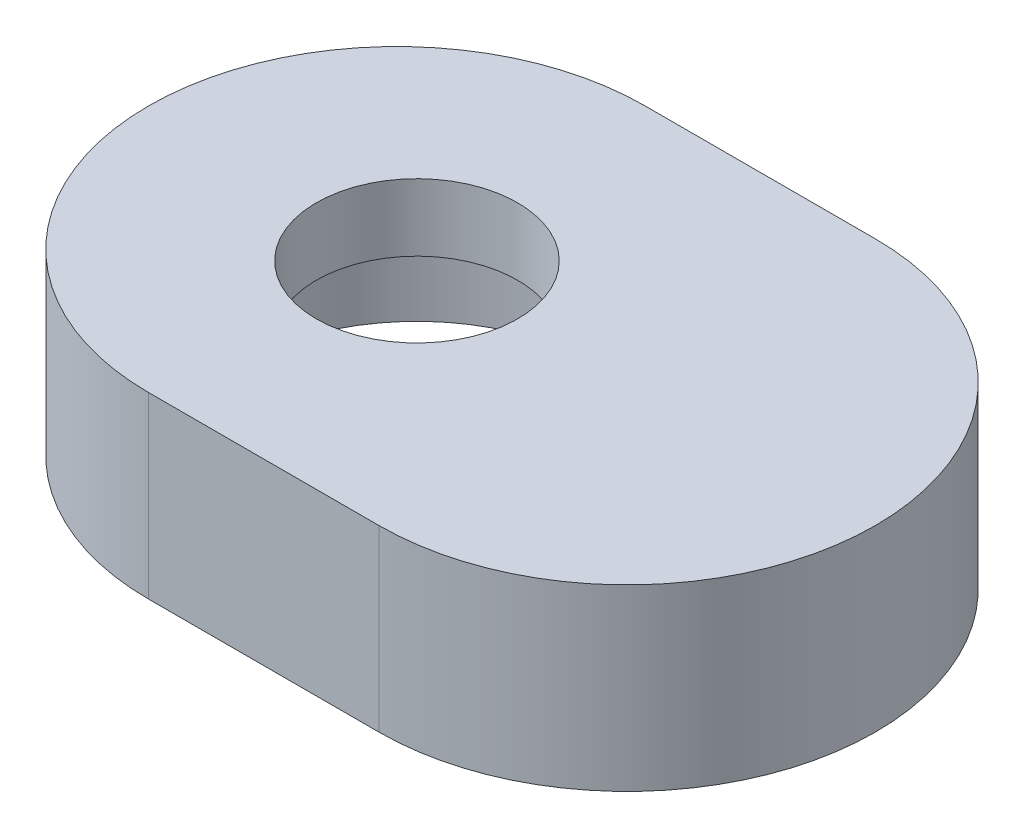
ISO-10303-21;
HEADER;
FILE_DESCRIPTION(('STEP AP214'),'2;1');
FILE_NAME('part.step','',(''),(''),'','','');
FILE_SCHEMA(('AUTOMOTIVE_DESIGN { 1 0 10303 214 1 1 1 1 }'));
ENDSEC;
DATA;
#1=APPLICATION_CONTEXT('core data for automotive mechanical design processes');
#2=APPLICATION_PROTOCOL_DEFINITION('international standard','automotive_design',2000,#1);
#3=PRODUCT_CONTEXT('',#1,'mechanical');
#4=PRODUCT('Part','Part','',(#3));
#5=PRODUCT_RELATED_PRODUCT_CATEGORY('part','',(#4));
#6=PRODUCT_DEFINITION_FORMATION('','',#4);
#7=PRODUCT_DEFINITION_CONTEXT('part definition',#1,'design');
#8=PRODUCT_DEFINITION('design','',#6,#7);
#9=PRODUCT_DEFINITION_SHAPE('','',#8);
#10=(LENGTH_UNIT() NAMED_UNIT(*) SI_UNIT(.MILLI.,.METRE.));
#11=(NAMED_UNIT(*) PLANE_ANGLE_UNIT() SI_UNIT($,.RADIAN.));
#12=(NAMED_UNIT(*) SI_UNIT($,.STERADIAN.) SOLID_ANGLE_UNIT());
#13=UNCERTAINTY_MEASURE_WITH_UNIT(LENGTH_MEASURE(1.E-05),#10,'distance_accuracy_value','');
#14=(GEOMETRIC_REPRESENTATION_CONTEXT(3) GLOBAL_UNCERTAINTY_ASSIGNED_CONTEXT((#13)) GLOBAL_UNIT_ASSIGNED_CONTEXT((#10,
#11,#12)) REPRESENTATION_CONTEXT('',''));
#15=CARTESIAN_POINT('',(0.,0.,0.));
#16=DIRECTION('',(0.,0.,1.));
#17=DIRECTION('',(1.,0.,0.));
#18=AXIS2_PLACEMENT_3D('',#15,#16,#17);
#19=CARTESIAN_POINT('',(-4.25,8.,0.));
#20=DIRECTION('',(0.,-1.,0.));
#21=DIRECTION('',(0.,0.,-1.));
#22=AXIS2_PLACEMENT_3D('',#19,#20,#21);
#23=CYLINDRICAL_SURFACE('',#22,8.);
#24=CARTESIAN_POINT('',(-4.25,0.,0.));
#25=DIRECTION('',(0.,1.,0.));
#26=DIRECTION('',(0.,0.,1.));
#27=AXIS2_PLACEMENT_3D('',#24,#25,#26);
#28=CIRCLE('',#27,8.);
#29=CARTESIAN_POINT('',(-4.25,0.,8.));
#30=VERTEX_POINT('',#29);
#31=EDGE_CURVE('E119',#30,#30,#28,.T.);
#32=ORIENTED_EDGE('',*,*,#31,.F.);
#33=EDGE_LOOP('',(#32));
#34=FACE_BOUND('',#33,.T.);
#35=CARTESIAN_POINT('',(-4.25,5.,0.));
#36=DIRECTION('',(0.,1.,0.));
#37=DIRECTION('',(0.,0.,1.));
#38=AXIS2_PLACEMENT_3D('',#35,#36,#37);
#39=CIRCLE('',#38,8.);
#40=CARTESIAN_POINT('',(-4.25,5.,8.));
#41=VERTEX_POINT('',#40);
#42=EDGE_CURVE('E47',#41,#41,#39,.T.);
#43=ORIENTED_EDGE('',*,*,#42,.T.);
#44=EDGE_LOOP('',(#43));
#45=FACE_BOUND('',#44,.T.);
#46=ADVANCED_FACE('F43',(#34,#45),#23,.F.);
#47=CARTESIAN_POINT('',(-5.15000000000002,8.,0.));
#48=DIRECTION('',(0.,1.,0.));
#49=DIRECTION('',(0.,0.,1.));
#50=AXIS2_PLACEMENT_3D('',#47,#48,#49);
#51=PLANE('',#50);
#52=CARTESIAN_POINT('',(-5.15000000000002,8.,0.));
#53=DIRECTION('',(0.,1.,0.));
#54=DIRECTION('',(0.,0.,1.));
#55=AXIS2_PLACEMENT_3D('',#52,#53,#54);
#56=CIRCLE('',#55,11.1);
#57=CARTESIAN_POINT('',(-5.15000000000002,8.,-11.1));
#58=VERTEX_POINT('',#57);
#59=CARTESIAN_POINT('',(-5.15000000000002,8.,11.1));
#60=VERTEX_POINT('',#59);
#61=EDGE_CURVE('E98',#58,#60,#56,.T.);
#62=ORIENTED_EDGE('',*,*,#61,.T.);
#63=DIRECTION('',(1.,0.,0.));
#64=VECTOR('',#63,1.);
#65=CARTESIAN_POINT('',(-5.15000000000002,8.,11.1));
#66=LINE('',#65,#64);
#67=CARTESIAN_POINT('',(5.15000000000002,8.,11.1));
#68=VERTEX_POINT('',#67);
#69=EDGE_CURVE('E92',#60,#68,#66,.T.);
#70=ORIENTED_EDGE('',*,*,#69,.T.);
#71=CARTESIAN_POINT('',(5.14999999999999,8.,0.));
#72=DIRECTION('',(0.,1.,0.));
#73=DIRECTION('',(0.,0.,1.));
#74=AXIS2_PLACEMENT_3D('',#71,#72,#73);
#75=CIRCLE('',#74,11.1);
#76=CARTESIAN_POINT('',(5.15000000000002,8.,-11.1));
#77=VERTEX_POINT('',#76);
#78=EDGE_CURVE('E96',#68,#77,#75,.T.);
#79=ORIENTED_EDGE('',*,*,#78,.T.);
#80=DIRECTION('',(-1.,0.,0.));
#81=VECTOR('',#80,1.);
#82=CARTESIAN_POINT('',(-5.15000000000002,8.,-11.1));
#83=LINE('',#82,#81);
#84=EDGE_CURVE('E62',#77,#58,#83,.T.);
#85=ORIENTED_EDGE('',*,*,#84,.T.);
#86=EDGE_LOOP('',(#62,#70,#79,#85));
#87=FACE_BOUND('',#86,.T.);
#88=CARTESIAN_POINT('',(-4.25,8.,0.));
#89=DIRECTION('',(0.,1.,0.));
#90=DIRECTION('',(0.,0.,1.));
#91=AXIS2_PLACEMENT_3D('',#88,#89,#90);
#92=CIRCLE('',#91,4.5);
#93=CARTESIAN_POINT('',(-4.25,8.,4.5));
#94=VERTEX_POINT('',#93);
#95=EDGE_CURVE('E140',#94,#94,#92,.T.);
#96=ORIENTED_EDGE('',*,*,#95,.F.);
#97=EDGE_LOOP('',(#96));
#98=FACE_BOUND('',#97,.T.);
#99=ADVANCED_FACE('F93',(#87,#98),#51,.T.);
#100=CARTESIAN_POINT('',(-5.15000000000002,0.,0.));
#101=DIRECTION('',(0.,1.,0.));
#102=DIRECTION('',(0.,0.,1.));
#103=AXIS2_PLACEMENT_3D('',#100,#101,#102);
#104=PLANE('',#103);
#105=CARTESIAN_POINT('',(-5.15000000000002,0.,0.));
#106=DIRECTION('',(0.,1.,0.));
#107=DIRECTION('',(0.,0.,1.));
#108=AXIS2_PLACEMENT_3D('',#105,#106,#107);
#109=CIRCLE('',#108,11.1);
#110=CARTESIAN_POINT('',(-5.15000000000002,0.,-11.1));
#111=VERTEX_POINT('',#110);
#112=CARTESIAN_POINT('',(-5.15000000000002,0.,11.1));
#113=VERTEX_POINT('',#112);
#114=EDGE_CURVE('E115',#111,#113,#109,.T.);
#115=ORIENTED_EDGE('',*,*,#114,.F.);
#116=DIRECTION('',(-1.,0.,0.));
#117=VECTOR('',#116,1.);
#118=CARTESIAN_POINT('',(-5.15000000000002,0.,-11.1));
#119=LINE('',#118,#117);
#120=CARTESIAN_POINT('',(5.15000000000002,0.,-11.1));
#121=VERTEX_POINT('',#120);
#122=EDGE_CURVE('E85',#121,#111,#119,.T.);
#123=ORIENTED_EDGE('',*,*,#122,.F.);
#124=CARTESIAN_POINT('',(5.14999999999999,0.,0.));
#125=DIRECTION('',(0.,1.,0.));
#126=DIRECTION('',(0.,0.,1.));
#127=AXIS2_PLACEMENT_3D('',#124,#125,#126);
#128=CIRCLE('',#127,11.1);
#129=CARTESIAN_POINT('',(5.15000000000002,0.,11.1));
#130=VERTEX_POINT('',#129);
#131=EDGE_CURVE('E79',#130,#121,#128,.T.);
#132=ORIENTED_EDGE('',*,*,#131,.F.);
#133=DIRECTION('',(1.,0.,0.));
#134=VECTOR('',#133,1.);
#135=CARTESIAN_POINT('',(-5.15000000000002,0.,11.1));
#136=LINE('',#135,#134);
#137=EDGE_CURVE('E103',#113,#130,#136,.T.);
#138=ORIENTED_EDGE('',*,*,#137,.F.);
#139=EDGE_LOOP('',(#115,#123,#132,#138));
#140=FACE_BOUND('',#139,.T.);
#141=ORIENTED_EDGE('',*,*,#31,.T.);
#142=EDGE_LOOP('',(#141));
#143=FACE_BOUND('',#142,.T.);
#144=ADVANCED_FACE('F132',(#140,#143),#104,.F.);
#145=CARTESIAN_POINT('',(-5.15000000000002,8.,0.));
#146=DIRECTION('',(0.,-1.,0.));
#147=DIRECTION('',(0.,0.,-1.));
#148=AXIS2_PLACEMENT_3D('',#145,#146,#147);
#149=CYLINDRICAL_SURFACE('',#148,11.1);
#150=ORIENTED_EDGE('',*,*,#114,.T.);
#151=DIRECTION('',(0.,-1.,0.));
#152=VECTOR('',#151,1.);
#153=CARTESIAN_POINT('',(-5.15000000000002,8.,11.1));
#154=LINE('',#153,#152);
#155=EDGE_CURVE('E11',#60,#113,#154,.T.);
#156=ORIENTED_EDGE('',*,*,#155,.F.);
#157=ORIENTED_EDGE('',*,*,#61,.F.);
#158=DIRECTION('',(0.,-1.,0.));
#159=VECTOR('',#158,1.);
#160=CARTESIAN_POINT('',(-5.15000000000002,8.,-11.1));
#161=LINE('',#160,#159);
#162=EDGE_CURVE('E111',#58,#111,#161,.T.);
#163=ORIENTED_EDGE('',*,*,#162,.T.);
#164=EDGE_LOOP('',(#150,#156,#157,#163));
#165=FACE_BOUND('',#164,.T.);
#166=ADVANCED_FACE('F45',(#165),#149,.T.);
#167=CARTESIAN_POINT('',(-5.15000000000002,8.,11.1));
#168=DIRECTION('',(0.,0.,-1.));
#169=DIRECTION('',(-1.,0.,0.));
#170=AXIS2_PLACEMENT_3D('',#167,#168,#169);
#171=PLANE('',#170);
#172=ORIENTED_EDGE('',*,*,#137,.T.);
#173=DIRECTION('',(0.,-1.,0.));
#174=VECTOR('',#173,1.);
#175=CARTESIAN_POINT('',(5.15000000000002,8.,11.1));
#176=LINE('',#175,#174);
#177=EDGE_CURVE('E54',#68,#130,#176,.T.);
#178=ORIENTED_EDGE('',*,*,#177,.F.);
#179=ORIENTED_EDGE('',*,*,#69,.F.);
#180=ORIENTED_EDGE('',*,*,#155,.T.);
#181=EDGE_LOOP('',(#172,#178,#179,#180));
#182=FACE_BOUND('',#181,.T.);
#183=ADVANCED_FACE('F102',(#182),#171,.F.);
#184=CARTESIAN_POINT('',(5.14999999999999,8.,0.));
#185=DIRECTION('',(0.,-1.,0.));
#186=DIRECTION('',(0.,0.,-1.));
#187=AXIS2_PLACEMENT_3D('',#184,#185,#186);
#188=CYLINDRICAL_SURFACE('',#187,11.1);
#189=ORIENTED_EDGE('',*,*,#131,.T.);
#190=DIRECTION('',(0.,-1.,0.));
#191=VECTOR('',#190,1.);
#192=CARTESIAN_POINT('',(5.15000000000002,8.,-11.1));
#193=LINE('',#192,#191);
#194=EDGE_CURVE('E105',#77,#121,#193,.T.);
#195=ORIENTED_EDGE('',*,*,#194,.F.);
#196=ORIENTED_EDGE('',*,*,#78,.F.);
#197=ORIENTED_EDGE('',*,*,#177,.T.);
#198=EDGE_LOOP('',(#189,#195,#196,#197));
#199=FACE_BOUND('',#198,.T.);
#200=ADVANCED_FACE('F107',(#199),#188,.T.);
#201=CARTESIAN_POINT('',(-5.15000000000002,8.,-11.1));
#202=DIRECTION('',(0.,0.,1.));
#203=DIRECTION('',(1.,0.,0.));
#204=AXIS2_PLACEMENT_3D('',#201,#202,#203);
#205=PLANE('',#204);
#206=ORIENTED_EDGE('',*,*,#122,.T.);
#207=ORIENTED_EDGE('',*,*,#162,.F.);
#208=ORIENTED_EDGE('',*,*,#84,.F.);
#209=ORIENTED_EDGE('',*,*,#194,.T.);
#210=EDGE_LOOP('',(#206,#207,#208,#209));
#211=FACE_BOUND('',#210,.T.);
#212=ADVANCED_FACE('F129',(#211),#205,.F.);
#213=CARTESIAN_POINT('',(-4.25,5.,0.));
#214=DIRECTION('',(0.,1.,0.));
#215=DIRECTION('',(0.,0.,1.));
#216=AXIS2_PLACEMENT_3D('',#213,#214,#215);
#217=PLANE('',#216);
#218=CARTESIAN_POINT('',(-4.25,5.,0.));
#219=DIRECTION('',(0.,1.,0.));
#220=DIRECTION('',(0.,0.,1.));
#221=AXIS2_PLACEMENT_3D('',#218,#219,#220);
#222=CIRCLE('',#221,4.5);
#223=CARTESIAN_POINT('',(-4.25,5.,4.5));
#224=VERTEX_POINT('',#223);
#225=EDGE_CURVE('E144',#224,#224,#222,.T.);
#226=ORIENTED_EDGE('',*,*,#225,.T.);
#227=EDGE_LOOP('',(#226));
#228=FACE_BOUND('',#227,.T.);
#229=ORIENTED_EDGE('',*,*,#42,.F.);
#230=EDGE_LOOP('',(#229));
#231=FACE_BOUND('',#230,.T.);
#232=ADVANCED_FACE('F154',(#228,#231),#217,.F.);
#233=CARTESIAN_POINT('',(-4.25,5.,0.));
#234=DIRECTION('',(0.,1.,0.));
#235=DIRECTION('',(0.,0.,1.));
#236=AXIS2_PLACEMENT_3D('',#233,#234,#235);
#237=CYLINDRICAL_SURFACE('',#236,4.5);
#238=ORIENTED_EDGE('',*,*,#225,.F.);
#239=EDGE_LOOP('',(#238));
#240=FACE_BOUND('',#239,.T.);
#241=ORIENTED_EDGE('',*,*,#95,.T.);
#242=EDGE_LOOP('',(#241));
#243=FACE_BOUND('',#242,.T.);
#244=ADVANCED_FACE('F156',(#240,#243),#237,.F.);
#245=CLOSED_SHELL('',(#46,#99,#144,#166,#183,#200,#212,#232,#244));
#246=MANIFOLD_SOLID_BREP('B2',#245);
#247=ADVANCED_BREP_SHAPE_REPRESENTATION('',(#18,#246),#14);
#248=SHAPE_DEFINITION_REPRESENTATION(#9,#247);
ENDSEC;
END-ISO-10303-21;
